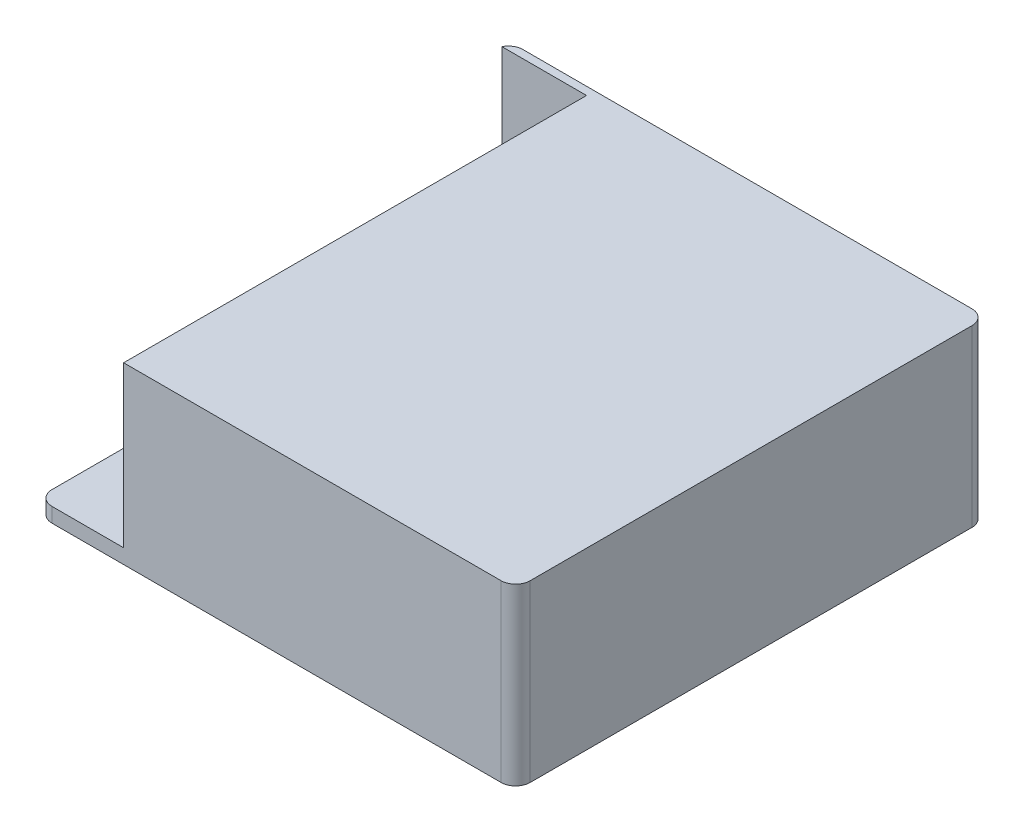
ISO-10303-21;
HEADER;
FILE_DESCRIPTION(('STEP AP214'),'2;1');
FILE_NAME('part.step','',(''),(''),'','','');
FILE_SCHEMA(('AUTOMOTIVE_DESIGN { 1 0 10303 214 1 1 1 1 }'));
ENDSEC;
DATA;
#1=APPLICATION_CONTEXT('core data for automotive mechanical design processes');
#2=APPLICATION_PROTOCOL_DEFINITION('international standard','automotive_design',2000,#1);
#3=PRODUCT_CONTEXT('',#1,'mechanical');
#4=PRODUCT('Part','Part','',(#3));
#5=PRODUCT_RELATED_PRODUCT_CATEGORY('part','',(#4));
#6=PRODUCT_DEFINITION_FORMATION('','',#4);
#7=PRODUCT_DEFINITION_CONTEXT('part definition',#1,'design');
#8=PRODUCT_DEFINITION('design','',#6,#7);
#9=PRODUCT_DEFINITION_SHAPE('','',#8);
#10=(LENGTH_UNIT() NAMED_UNIT(*) SI_UNIT(.MILLI.,.METRE.));
#11=(NAMED_UNIT(*) PLANE_ANGLE_UNIT() SI_UNIT($,.RADIAN.));
#12=(NAMED_UNIT(*) SI_UNIT($,.STERADIAN.) SOLID_ANGLE_UNIT());
#13=UNCERTAINTY_MEASURE_WITH_UNIT(LENGTH_MEASURE(1.E-05),#10,'distance_accuracy_value','');
#14=(GEOMETRIC_REPRESENTATION_CONTEXT(3) GLOBAL_UNCERTAINTY_ASSIGNED_CONTEXT((#13)) GLOBAL_UNIT_ASSIGNED_CONTEXT((#10,
#11,#12)) REPRESENTATION_CONTEXT('',''));
#15=CARTESIAN_POINT('',(0.,0.,0.));
#16=DIRECTION('',(0.,0.,1.));
#17=DIRECTION('',(1.,0.,0.));
#18=AXIS2_PLACEMENT_3D('',#15,#16,#17);
#19=CARTESIAN_POINT('',(-49.25,15.,-37.7044971877989));
#20=DIRECTION('',(1.,0.,0.));
#21=DIRECTION('',(0.,0.,-1.));
#22=AXIS2_PLACEMENT_3D('',#19,#20,#21);
#23=PLANE('',#22);
#24=DIRECTION('',(0.,0.,1.));
#25=VECTOR('',#24,1.);
#26=CARTESIAN_POINT('',(-49.25,3.,-37.7044971877989));
#27=LINE('',#26,#25);
#28=CARTESIAN_POINT('',(-49.25,3.,-37.7044971877989));
#29=VERTEX_POINT('',#28);
#30=CARTESIAN_POINT('',(-49.25,3.,20.5839109430793));
#31=VERTEX_POINT('',#30);
#32=EDGE_CURVE('E108',#29,#31,#27,.T.);
#33=ORIENTED_EDGE('',*,*,#32,.T.);
#34=DIRECTION('',(0.,-1.,0.));
#35=VECTOR('',#34,1.);
#36=CARTESIAN_POINT('',(-49.25,15.,20.5839109430793));
#37=LINE('',#36,#35);
#38=CARTESIAN_POINT('',(-49.25,15.,20.5839109430793));
#39=VERTEX_POINT('',#38);
#40=EDGE_CURVE('E12',#39,#31,#37,.T.);
#41=ORIENTED_EDGE('',*,*,#40,.F.);
#42=DIRECTION('',(0.,0.,1.));
#43=VECTOR('',#42,1.);
#44=CARTESIAN_POINT('',(-49.25,15.,-37.7044971877989));
#45=LINE('',#44,#43);
#46=CARTESIAN_POINT('',(-49.25,15.,-37.7044971877989));
#47=VERTEX_POINT('',#46);
#48=EDGE_CURVE('E96',#47,#39,#45,.T.);
#49=ORIENTED_EDGE('',*,*,#48,.F.);
#50=DIRECTION('',(0.,-1.,0.));
#51=VECTOR('',#50,1.);
#52=CARTESIAN_POINT('',(-49.25,15.,-37.7044971877989));
#53=LINE('',#52,#51);
#54=EDGE_CURVE('E104',#47,#29,#53,.T.);
#55=ORIENTED_EDGE('',*,*,#54,.T.);
#56=EDGE_LOOP('',(#33,#41,#49,#55));
#57=FACE_BOUND('',#56,.T.);
#58=ADVANCED_FACE('F45',(#57),#23,.F.);
#59=CARTESIAN_POINT('',(-49.25,15.,20.5839109430793));
#60=DIRECTION('',(0.,0.,-1.));
#61=DIRECTION('',(-1.,0.,0.));
#62=AXIS2_PLACEMENT_3D('',#59,#60,#61);
#63=PLANE('',#62);
#64=DIRECTION('',(1.,0.,0.));
#65=VECTOR('',#64,1.);
#66=CARTESIAN_POINT('',(-49.25,3.,20.5839109430793));
#67=LINE('',#66,#65);
#68=CARTESIAN_POINT('',(-31.4966510303624,3.,20.5839109430793));
#69=VERTEX_POINT('',#68);
#70=EDGE_CURVE('E100',#31,#69,#67,.T.);
#71=ORIENTED_EDGE('',*,*,#70,.T.);
#72=DIRECTION('',(0.,-1.,0.));
#73=VECTOR('',#72,1.);
#74=CARTESIAN_POINT('',(-31.4966510303624,15.,20.5839109430793));
#75=LINE('',#74,#73);
#76=CARTESIAN_POINT('',(-31.4966510303624,15.,20.5839109430793));
#77=VERTEX_POINT('',#76);
#78=EDGE_CURVE('E53',#77,#69,#75,.T.);
#79=ORIENTED_EDGE('',*,*,#78,.F.);
#80=DIRECTION('',(1.,0.,0.));
#81=VECTOR('',#80,1.);
#82=CARTESIAN_POINT('',(-49.25,15.,20.5839109430793));
#83=LINE('',#82,#81);
#84=EDGE_CURVE('E91',#39,#77,#83,.T.);
#85=ORIENTED_EDGE('',*,*,#84,.F.);
#86=ORIENTED_EDGE('',*,*,#40,.T.);
#87=EDGE_LOOP('',(#71,#79,#85,#86));
#88=FACE_BOUND('',#87,.T.);
#89=ADVANCED_FACE('F99',(#88),#63,.F.);
#90=CARTESIAN_POINT('',(-31.4966510303624,15.,-37.7044971877989));
#91=DIRECTION('',(-1.,0.,0.));
#92=DIRECTION('',(0.,0.,1.));
#93=AXIS2_PLACEMENT_3D('',#90,#91,#92);
#94=PLANE('',#93);
#95=DIRECTION('',(0.,0.,-1.));
#96=VECTOR('',#95,1.);
#97=CARTESIAN_POINT('',(-31.4966510303624,3.,-37.7044971877989));
#98=LINE('',#97,#96);
#99=CARTESIAN_POINT('',(-31.4966510303624,3.,-37.7044971877989));
#100=VERTEX_POINT('',#99);
#101=EDGE_CURVE('E78',#69,#100,#98,.T.);
#102=ORIENTED_EDGE('',*,*,#101,.T.);
#103=DIRECTION('',(0.,-1.,0.));
#104=VECTOR('',#103,1.);
#105=CARTESIAN_POINT('',(-31.4966510303624,15.,-37.7044971877989));
#106=LINE('',#105,#104);
#107=CARTESIAN_POINT('',(-31.4966510303624,15.,-37.7044971877989));
#108=VERTEX_POINT('',#107);
#109=EDGE_CURVE('E101',#108,#100,#106,.T.);
#110=ORIENTED_EDGE('',*,*,#109,.F.);
#111=DIRECTION('',(0.,0.,-1.));
#112=VECTOR('',#111,1.);
#113=CARTESIAN_POINT('',(-31.4966510303624,15.,-37.7044971877989));
#114=LINE('',#113,#112);
#115=EDGE_CURVE('E94',#77,#108,#114,.T.);
#116=ORIENTED_EDGE('',*,*,#115,.F.);
#117=ORIENTED_EDGE('',*,*,#78,.T.);
#118=EDGE_LOOP('',(#102,#110,#116,#117));
#119=FACE_BOUND('',#118,.T.);
#120=ADVANCED_FACE('F102',(#119),#94,.F.);
#121=CARTESIAN_POINT('',(-49.25,15.,-37.7044971877989));
#122=DIRECTION('',(0.,0.,1.));
#123=DIRECTION('',(1.,0.,0.));
#124=AXIS2_PLACEMENT_3D('',#121,#122,#123);
#125=PLANE('',#124);
#126=DIRECTION('',(-1.,0.,0.));
#127=VECTOR('',#126,1.);
#128=CARTESIAN_POINT('',(-49.25,3.,-37.7044971877989));
#129=LINE('',#128,#127);
#130=EDGE_CURVE('E84',#100,#29,#129,.T.);
#131=ORIENTED_EDGE('',*,*,#130,.T.);
#132=ORIENTED_EDGE('',*,*,#54,.F.);
#133=DIRECTION('',(-1.,0.,0.));
#134=VECTOR('',#133,1.);
#135=CARTESIAN_POINT('',(-49.25,15.,-37.7044971877989));
#136=LINE('',#135,#134);
#137=EDGE_CURVE('E61',#108,#47,#136,.T.);
#138=ORIENTED_EDGE('',*,*,#137,.F.);
#139=ORIENTED_EDGE('',*,*,#109,.T.);
#140=EDGE_LOOP('',(#131,#132,#138,#139));
#141=FACE_BOUND('',#140,.T.);
#142=ADVANCED_FACE('F115',(#141),#125,.F.);
#143=CARTESIAN_POINT('',(0.,15.,0.));
#144=DIRECTION('',(0.,1.,0.));
#145=DIRECTION('',(0.,0.,1.));
#146=AXIS2_PLACEMENT_3D('',#143,#144,#145);
#147=PLANE('',#146);
#148=ORIENTED_EDGE('',*,*,#48,.T.);
#149=ORIENTED_EDGE('',*,*,#84,.T.);
#150=ORIENTED_EDGE('',*,*,#115,.T.);
#151=ORIENTED_EDGE('',*,*,#137,.T.);
#152=EDGE_LOOP('',(#148,#149,#150,#151));
#153=FACE_BOUND('',#152,.T.);
#154=ADVANCED_FACE('F92',(#153),#147,.T.);
#155=CARTESIAN_POINT('',(0.,3.,0.));
#156=DIRECTION('',(0.,1.,0.));
#157=DIRECTION('',(0.,0.,1.));
#158=AXIS2_PLACEMENT_3D('',#155,#156,#157);
#159=PLANE('',#158);
#160=ORIENTED_EDGE('',*,*,#32,.F.);
#161=ORIENTED_EDGE('',*,*,#130,.F.);
#162=ORIENTED_EDGE('',*,*,#101,.F.);
#163=ORIENTED_EDGE('',*,*,#70,.F.);
#164=EDGE_LOOP('',(#160,#161,#162,#163));
#165=FACE_BOUND('',#164,.T.);
#166=ADVANCED_FACE('F118',(#165),#159,.F.);
#167=CLOSED_SHELL('',(#58,#89,#120,#142,#154,#166));
#168=MANIFOLD_SOLID_BREP('B2',#167);
#169=CARTESIAN_POINT('',(-49.25,36.,-45.5));
#170=DIRECTION('',(1.,0.,0.));
#171=DIRECTION('',(0.,0.,-1.));
#172=AXIS2_PLACEMENT_3D('',#169,#170,#171);
#173=PLANE('',#172);
#174=DIRECTION('',(0.,0.,1.));
#175=VECTOR('',#174,1.);
#176=CARTESIAN_POINT('',(-49.25,3.,-45.5));
#177=LINE('',#176,#175);
#178=CARTESIAN_POINT('',(-49.25,3.,-45.5));
#179=VERTEX_POINT('',#178);
#180=CARTESIAN_POINT('',(-49.25,3.,45.5));
#181=VERTEX_POINT('',#180);
#182=EDGE_CURVE('E317',#179,#181,#177,.T.);
#183=ORIENTED_EDGE('',*,*,#182,.F.);
#184=DIRECTION('',(0.,-1.,0.));
#185=VECTOR('',#184,1.);
#186=CARTESIAN_POINT('',(-49.25,36.,-45.5));
#187=LINE('',#186,#185);
#188=CARTESIAN_POINT('',(-49.25,0.,-45.5));
#189=VERTEX_POINT('',#188);
#190=EDGE_CURVE('E295',#179,#189,#187,.T.);
#191=ORIENTED_EDGE('',*,*,#190,.T.);
#192=DIRECTION('',(0.,0.,1.));
#193=VECTOR('',#192,1.);
#194=CARTESIAN_POINT('',(-49.25,0.,-45.5));
#195=LINE('',#194,#193);
#196=CARTESIAN_POINT('',(-49.25,0.,45.5));
#197=VERTEX_POINT('',#196);
#198=EDGE_CURVE('E282',#189,#197,#195,.T.);
#199=ORIENTED_EDGE('',*,*,#198,.T.);
#200=DIRECTION('',(0.,-1.,0.));
#201=VECTOR('',#200,1.);
#202=CARTESIAN_POINT('',(-49.25,36.,45.5));
#203=LINE('',#202,#201);
#204=EDGE_CURVE('E293',#181,#197,#203,.T.);
#205=ORIENTED_EDGE('',*,*,#204,.F.);
#206=EDGE_LOOP('',(#183,#191,#199,#205));
#207=FACE_BOUND('',#206,.T.);
#208=ADVANCED_FACE('F169',(#207),#173,.F.);
#209=CARTESIAN_POINT('',(-46.25,36.,45.5));
#210=DIRECTION('',(0.,-1.,0.));
#211=DIRECTION('',(0.,0.,-1.));
#212=AXIS2_PLACEMENT_3D('',#209,#210,#211);
#213=CYLINDRICAL_SURFACE('',#212,3.);
#214=CARTESIAN_POINT('',(-46.25,3.,45.5));
#215=DIRECTION('',(0.,1.,0.));
#216=DIRECTION('',(0.,0.,1.));
#217=AXIS2_PLACEMENT_3D('',#214,#215,#216);
#218=CIRCLE('',#217,3.);
#219=CARTESIAN_POINT('',(-46.25,3.,48.5));
#220=VERTEX_POINT('',#219);
#221=EDGE_CURVE('E320',#181,#220,#218,.T.);
#222=ORIENTED_EDGE('',*,*,#221,.F.);
#223=ORIENTED_EDGE('',*,*,#204,.T.);
#224=CARTESIAN_POINT('',(-46.25,0.,45.5));
#225=DIRECTION('',(0.,1.,0.));
#226=DIRECTION('',(0.,0.,1.));
#227=AXIS2_PLACEMENT_3D('',#224,#225,#226);
#228=CIRCLE('',#227,3.);
#229=CARTESIAN_POINT('',(-46.25,0.,48.5));
#230=VERTEX_POINT('',#229);
#231=EDGE_CURVE('E285',#197,#230,#228,.T.);
#232=ORIENTED_EDGE('',*,*,#231,.T.);
#233=DIRECTION('',(0.,-1.,0.));
#234=VECTOR('',#233,1.);
#235=CARTESIAN_POINT('',(-46.25,36.,48.5));
#236=LINE('',#235,#234);
#237=EDGE_CURVE('E291',#220,#230,#236,.T.);
#238=ORIENTED_EDGE('',*,*,#237,.F.);
#239=EDGE_LOOP('',(#222,#223,#232,#238));
#240=FACE_BOUND('',#239,.T.);
#241=ADVANCED_FACE('F368',(#240),#213,.T.);
#242=CARTESIAN_POINT('',(46.25,36.,45.5));
#243=DIRECTION('',(0.,-1.,0.));
#244=DIRECTION('',(0.,0.,-1.));
#245=AXIS2_PLACEMENT_3D('',#242,#243,#244);
#246=CYLINDRICAL_SURFACE('',#245,3.);
#247=CARTESIAN_POINT('',(46.25,0.,45.5));
#248=DIRECTION('',(0.,1.,0.));
#249=DIRECTION('',(0.,0.,-1.));
#250=AXIS2_PLACEMENT_3D('',#247,#248,#249);
#251=CIRCLE('',#250,3.);
#252=CARTESIAN_POINT('',(46.25,0.,48.5));
#253=VERTEX_POINT('',#252);
#254=CARTESIAN_POINT('',(49.25,0.,45.5));
#255=VERTEX_POINT('',#254);
#256=EDGE_CURVE('E270',#253,#255,#251,.T.);
#257=ORIENTED_EDGE('',*,*,#256,.T.);
#258=DIRECTION('',(0.,-1.,0.));
#259=VECTOR('',#258,1.);
#260=CARTESIAN_POINT('',(49.25,36.,45.5));
#261=LINE('',#260,#259);
#262=CARTESIAN_POINT('',(49.25,36.,45.5));
#263=VERTEX_POINT('',#262);
#264=EDGE_CURVE('E299',#263,#255,#261,.T.);
#265=ORIENTED_EDGE('',*,*,#264,.F.);
#266=CARTESIAN_POINT('',(46.25,36.,45.5));
#267=DIRECTION('',(0.,1.,0.));
#268=DIRECTION('',(0.,0.,-1.));
#269=AXIS2_PLACEMENT_3D('',#266,#267,#268);
#270=CIRCLE('',#269,3.);
#271=CARTESIAN_POINT('',(46.25,36.,48.5));
#272=VERTEX_POINT('',#271);
#273=EDGE_CURVE('E289',#272,#263,#270,.T.);
#274=ORIENTED_EDGE('',*,*,#273,.F.);
#275=DIRECTION('',(0.,-1.,0.));
#276=VECTOR('',#275,1.);
#277=CARTESIAN_POINT('',(46.25,36.,48.5));
#278=LINE('',#277,#276);
#279=EDGE_CURVE('E269',#272,#253,#278,.T.);
#280=ORIENTED_EDGE('',*,*,#279,.T.);
#281=EDGE_LOOP('',(#257,#265,#274,#280));
#282=FACE_BOUND('',#281,.T.);
#283=ADVANCED_FACE('F171',(#282),#246,.T.);
#284=CARTESIAN_POINT('',(49.25,36.,-45.5));
#285=DIRECTION('',(-1.,0.,0.));
#286=DIRECTION('',(0.,0.,1.));
#287=AXIS2_PLACEMENT_3D('',#284,#285,#286);
#288=PLANE('',#287);
#289=DIRECTION('',(0.,0.,-1.));
#290=VECTOR('',#289,1.);
#291=CARTESIAN_POINT('',(49.25,0.,-45.5));
#292=LINE('',#291,#290);
#293=CARTESIAN_POINT('',(49.25,0.,-45.5));
#294=VERTEX_POINT('',#293);
#295=EDGE_CURVE('E273',#255,#294,#292,.T.);
#296=ORIENTED_EDGE('',*,*,#295,.T.);
#297=DIRECTION('',(0.,-1.,0.));
#298=VECTOR('',#297,1.);
#299=CARTESIAN_POINT('',(49.25,36.,-45.5));
#300=LINE('',#299,#298);
#301=CARTESIAN_POINT('',(49.25,36.,-45.5));
#302=VERTEX_POINT('',#301);
#303=EDGE_CURVE('E257',#302,#294,#300,.T.);
#304=ORIENTED_EDGE('',*,*,#303,.F.);
#305=DIRECTION('',(0.,0.,-1.));
#306=VECTOR('',#305,1.);
#307=CARTESIAN_POINT('',(49.25,36.,-45.5));
#308=LINE('',#307,#306);
#309=EDGE_CURVE('E234',#263,#302,#308,.T.);
#310=ORIENTED_EDGE('',*,*,#309,.F.);
#311=ORIENTED_EDGE('',*,*,#264,.T.);
#312=EDGE_LOOP('',(#296,#304,#310,#311));
#313=FACE_BOUND('',#312,.T.);
#314=ADVANCED_FACE('F375',(#313),#288,.F.);
#315=CARTESIAN_POINT('',(46.25,36.,-45.5));
#316=DIRECTION('',(0.,-1.,0.));
#317=DIRECTION('',(0.,0.,-1.));
#318=AXIS2_PLACEMENT_3D('',#315,#316,#317);
#319=CYLINDRICAL_SURFACE('',#318,3.);
#320=CARTESIAN_POINT('',(46.25,0.,-45.5));
#321=DIRECTION('',(0.,1.,0.));
#322=DIRECTION('',(0.,0.,1.));
#323=AXIS2_PLACEMENT_3D('',#320,#321,#322);
#324=CIRCLE('',#323,3.);
#325=CARTESIAN_POINT('',(46.25,0.,-48.5));
#326=VERTEX_POINT('',#325);
#327=EDGE_CURVE('E254',#294,#326,#324,.T.);
#328=ORIENTED_EDGE('',*,*,#327,.T.);
#329=DIRECTION('',(0.,-1.,0.));
#330=VECTOR('',#329,1.);
#331=CARTESIAN_POINT('',(46.25,36.,-48.5));
#332=LINE('',#331,#330);
#333=CARTESIAN_POINT('',(46.25,36.,-48.5));
#334=VERTEX_POINT('',#333);
#335=EDGE_CURVE('E251',#334,#326,#332,.T.);
#336=ORIENTED_EDGE('',*,*,#335,.F.);
#337=CARTESIAN_POINT('',(46.25,36.,-45.5));
#338=DIRECTION('',(0.,1.,0.));
#339=DIRECTION('',(0.,0.,1.));
#340=AXIS2_PLACEMENT_3D('',#337,#338,#339);
#341=CIRCLE('',#340,3.);
#342=EDGE_CURVE('E240',#302,#334,#341,.T.);
#343=ORIENTED_EDGE('',*,*,#342,.F.);
#344=ORIENTED_EDGE('',*,*,#303,.T.);
#345=EDGE_LOOP('',(#328,#336,#343,#344));
#346=FACE_BOUND('',#345,.T.);
#347=ADVANCED_FACE('F252',(#346),#319,.T.);
#348=CARTESIAN_POINT('',(-46.25,36.,-48.5));
#349=DIRECTION('',(0.,0.,1.));
#350=DIRECTION('',(1.,0.,0.));
#351=AXIS2_PLACEMENT_3D('',#348,#349,#350);
#352=PLANE('',#351);
#353=DIRECTION('',(-1.,0.,0.));
#354=VECTOR('',#353,1.);
#355=CARTESIAN_POINT('',(-46.25,0.,-48.5));
#356=LINE('',#355,#354);
#357=CARTESIAN_POINT('',(-46.25,0.,-48.5));
#358=VERTEX_POINT('',#357);
#359=EDGE_CURVE('E277',#326,#358,#356,.T.);
#360=ORIENTED_EDGE('',*,*,#359,.T.);
#361=DIRECTION('',(0.,-1.,0.));
#362=VECTOR('',#361,1.);
#363=CARTESIAN_POINT('',(-46.25,36.,-48.5));
#364=LINE('',#363,#362);
#365=CARTESIAN_POINT('',(-46.25,36.,-48.5));
#366=VERTEX_POINT('',#365);
#367=EDGE_CURVE('E258',#366,#358,#364,.T.);
#368=ORIENTED_EDGE('',*,*,#367,.F.);
#369=DIRECTION('',(-1.,0.,0.));
#370=VECTOR('',#369,1.);
#371=CARTESIAN_POINT('',(-46.25,36.,-48.5));
#372=LINE('',#371,#370);
#373=EDGE_CURVE('E245',#334,#366,#372,.T.);
#374=ORIENTED_EDGE('',*,*,#373,.F.);
#375=ORIENTED_EDGE('',*,*,#335,.T.);
#376=EDGE_LOOP('',(#360,#368,#374,#375));
#377=FACE_BOUND('',#376,.T.);
#378=ADVANCED_FACE('F260',(#377),#352,.F.);
#379=CARTESIAN_POINT('',(-46.25,36.,-45.5));
#380=DIRECTION('',(0.,-1.,0.));
#381=DIRECTION('',(0.,0.,-1.));
#382=AXIS2_PLACEMENT_3D('',#379,#380,#381);
#383=CYLINDRICAL_SURFACE('',#382,3.);
#384=CARTESIAN_POINT('',(-46.25,3.,-45.5));
#385=DIRECTION('',(0.,1.,0.));
#386=DIRECTION('',(0.,0.,1.));
#387=AXIS2_PLACEMENT_3D('',#384,#385,#386);
#388=CIRCLE('',#387,3.);
#389=CARTESIAN_POINT('',(-48.9276213397987,3.,-46.8529020513899));
#390=VERTEX_POINT('',#389);
#391=EDGE_CURVE('E274',#390,#179,#388,.T.);
#392=ORIENTED_EDGE('',*,*,#391,.F.);
#393=DIRECTION('',(0.,-1.,0.));
#394=VECTOR('',#393,1.);
#395=CARTESIAN_POINT('',(-48.9276213397987,36.,-46.8529020513899));
#396=LINE('',#395,#394);
#397=CARTESIAN_POINT('',(-48.9276213397987,36.,-46.8529020513899));
#398=VERTEX_POINT('',#397);
#399=EDGE_CURVE('E323',#390,#398,#396,.F.);
#400=ORIENTED_EDGE('',*,*,#399,.T.);
#401=CARTESIAN_POINT('',(-46.25,36.,-45.5));
#402=DIRECTION('',(0.,1.,0.));
#403=DIRECTION('',(0.,0.,-1.));
#404=AXIS2_PLACEMENT_3D('',#401,#402,#403);
#405=CIRCLE('',#404,3.);
#406=EDGE_CURVE('E263',#366,#398,#405,.T.);
#407=ORIENTED_EDGE('',*,*,#406,.F.);
#408=ORIENTED_EDGE('',*,*,#367,.T.);
#409=CARTESIAN_POINT('',(-46.25,0.,-45.5));
#410=DIRECTION('',(0.,1.,0.));
#411=DIRECTION('',(0.,0.,-1.));
#412=AXIS2_PLACEMENT_3D('',#409,#410,#411);
#413=CIRCLE('',#412,3.);
#414=EDGE_CURVE('E279',#358,#189,#413,.T.);
#415=ORIENTED_EDGE('',*,*,#414,.T.);
#416=ORIENTED_EDGE('',*,*,#190,.F.);
#417=EDGE_LOOP('',(#392,#400,#407,#408,#415,#416));
#418=FACE_BOUND('',#417,.T.);
#419=ADVANCED_FACE('F350',(#418),#383,.T.);
#420=CARTESIAN_POINT('',(-46.25,36.,48.5));
#421=DIRECTION('',(0.,0.,-1.));
#422=DIRECTION('',(-1.,0.,0.));
#423=AXIS2_PLACEMENT_3D('',#420,#421,#422);
#424=PLANE('',#423);
#425=DIRECTION('',(1.,0.,0.));
#426=VECTOR('',#425,1.);
#427=CARTESIAN_POINT('',(-46.25,36.,48.5));
#428=LINE('',#427,#426);
#429=CARTESIAN_POINT('',(-31.4966510303624,36.,48.5));
#430=VERTEX_POINT('',#429);
#431=EDGE_CURVE('E192',#430,#272,#428,.T.);
#432=ORIENTED_EDGE('',*,*,#431,.F.);
#433=DIRECTION('',(0.,-1.,0.));
#434=VECTOR('',#433,1.);
#435=CARTESIAN_POINT('',(-31.4966510303624,36.,48.5));
#436=LINE('',#435,#434);
#437=CARTESIAN_POINT('',(-31.4966510303624,3.,48.5));
#438=VERTEX_POINT('',#437);
#439=EDGE_CURVE('E184',#430,#438,#436,.T.);
#440=ORIENTED_EDGE('',*,*,#439,.T.);
#441=DIRECTION('',(1.,0.,0.));
#442=VECTOR('',#441,1.);
#443=CARTESIAN_POINT('',(-46.25,3.,48.5));
#444=LINE('',#443,#442);
#445=EDGE_CURVE('E43',#220,#438,#444,.T.);
#446=ORIENTED_EDGE('',*,*,#445,.F.);
#447=ORIENTED_EDGE('',*,*,#237,.T.);
#448=DIRECTION('',(1.,0.,0.));
#449=VECTOR('',#448,1.);
#450=CARTESIAN_POINT('',(-46.25,0.,48.5));
#451=LINE('',#450,#449);
#452=EDGE_CURVE('E225',#230,#253,#451,.T.);
#453=ORIENTED_EDGE('',*,*,#452,.T.);
#454=ORIENTED_EDGE('',*,*,#279,.F.);
#455=EDGE_LOOP('',(#432,#440,#446,#447,#453,#454));
#456=FACE_BOUND('',#455,.T.);
#457=ADVANCED_FACE('F306',(#456),#424,.F.);
#458=CARTESIAN_POINT('',(46.25,36.,45.5));
#459=DIRECTION('',(0.,-1.,0.));
#460=DIRECTION('',(0.,0.,-1.));
#461=AXIS2_PLACEMENT_3D('',#458,#459,#460);
#462=PLANE('',#461);
#463=ORIENTED_EDGE('',*,*,#406,.T.);
#464=DIRECTION('',(-1.,0.,0.));
#465=VECTOR('',#464,1.);
#466=CARTESIAN_POINT('',(-56.5894186562113,36.,-46.8529020513899));
#467=LINE('',#466,#465);
#468=CARTESIAN_POINT('',(-31.4966510303624,36.,-46.8529020513899));
#469=VERTEX_POINT('',#468);
#470=EDGE_CURVE('E303',#469,#398,#467,.T.);
#471=ORIENTED_EDGE('',*,*,#470,.F.);
#472=DIRECTION('',(0.,0.,1.));
#473=VECTOR('',#472,1.);
#474=CARTESIAN_POINT('',(-31.4966510303624,36.,45.5));
#475=LINE('',#474,#473);
#476=EDGE_CURVE('E177',#469,#430,#475,.T.);
#477=ORIENTED_EDGE('',*,*,#476,.T.);
#478=ORIENTED_EDGE('',*,*,#431,.T.);
#479=ORIENTED_EDGE('',*,*,#273,.T.);
#480=ORIENTED_EDGE('',*,*,#309,.T.);
#481=ORIENTED_EDGE('',*,*,#342,.T.);
#482=ORIENTED_EDGE('',*,*,#373,.T.);
#483=EDGE_LOOP('',(#463,#471,#477,#478,#479,#480,#481,#482));
#484=FACE_BOUND('',#483,.T.);
#485=ADVANCED_FACE('F243',(#484),#462,.F.);
#486=CARTESIAN_POINT('',(46.25,0.,45.5));
#487=DIRECTION('',(0.,-1.,0.));
#488=DIRECTION('',(0.,0.,-1.));
#489=AXIS2_PLACEMENT_3D('',#486,#487,#488);
#490=PLANE('',#489);
#491=ORIENTED_EDGE('',*,*,#256,.F.);
#492=ORIENTED_EDGE('',*,*,#452,.F.);
#493=ORIENTED_EDGE('',*,*,#231,.F.);
#494=ORIENTED_EDGE('',*,*,#198,.F.);
#495=ORIENTED_EDGE('',*,*,#414,.F.);
#496=ORIENTED_EDGE('',*,*,#359,.F.);
#497=ORIENTED_EDGE('',*,*,#327,.F.);
#498=ORIENTED_EDGE('',*,*,#295,.F.);
#499=EDGE_LOOP('',(#491,#492,#493,#494,#495,#496,#497,#498));
#500=FACE_BOUND('',#499,.T.);
#501=ADVANCED_FACE('F365',(#500),#490,.T.);
#502=CARTESIAN_POINT('',(0.,3.,0.));
#503=DIRECTION('',(0.,1.,0.));
#504=DIRECTION('',(0.,0.,1.));
#505=AXIS2_PLACEMENT_3D('',#502,#503,#504);
#506=PLANE('',#505);
#507=ORIENTED_EDGE('',*,*,#391,.T.);
#508=ORIENTED_EDGE('',*,*,#182,.T.);
#509=ORIENTED_EDGE('',*,*,#221,.T.);
#510=ORIENTED_EDGE('',*,*,#445,.T.);
#511=DIRECTION('',(0.,0.,-1.));
#512=VECTOR('',#511,1.);
#513=CARTESIAN_POINT('',(-31.4966510303624,3.,-46.8529020513899));
#514=LINE('',#513,#512);
#515=CARTESIAN_POINT('',(-31.4966510303624,3.,-46.8529020513899));
#516=VERTEX_POINT('',#515);
#517=EDGE_CURVE('E331',#438,#516,#514,.T.);
#518=ORIENTED_EDGE('',*,*,#517,.T.);
#519=DIRECTION('',(-1.,0.,0.));
#520=VECTOR('',#519,1.);
#521=CARTESIAN_POINT('',(-56.5894186562113,3.,-46.8529020513899));
#522=LINE('',#521,#520);
#523=EDGE_CURVE('E329',#516,#390,#522,.T.);
#524=ORIENTED_EDGE('',*,*,#523,.T.);
#525=EDGE_LOOP('',(#507,#508,#509,#510,#518,#524));
#526=FACE_BOUND('',#525,.T.);
#527=ADVANCED_FACE('F337',(#526),#506,.T.);
#528=CARTESIAN_POINT('',(-56.5894186562113,3.,-46.8529020513899));
#529=DIRECTION('',(0.,0.,-1.));
#530=DIRECTION('',(-1.,0.,0.));
#531=AXIS2_PLACEMENT_3D('',#528,#529,#530);
#532=PLANE('',#531);
#533=ORIENTED_EDGE('',*,*,#523,.F.);
#534=DIRECTION('',(0.,1.,0.));
#535=VECTOR('',#534,1.);
#536=CARTESIAN_POINT('',(-31.4966510303624,3.,-46.8529020513899));
#537=LINE('',#536,#535);
#538=EDGE_CURVE('E327',#516,#469,#537,.T.);
#539=ORIENTED_EDGE('',*,*,#538,.T.);
#540=ORIENTED_EDGE('',*,*,#470,.T.);
#541=ORIENTED_EDGE('',*,*,#399,.F.);
#542=EDGE_LOOP('',(#533,#539,#540,#541));
#543=FACE_BOUND('',#542,.T.);
#544=ADVANCED_FACE('F345',(#543),#532,.F.);
#545=CARTESIAN_POINT('',(-31.4966510303624,3.,-46.8529020513899));
#546=DIRECTION('',(1.,0.,0.));
#547=DIRECTION('',(0.,0.,-1.));
#548=AXIS2_PLACEMENT_3D('',#545,#546,#547);
#549=PLANE('',#548);
#550=ORIENTED_EDGE('',*,*,#476,.F.);
#551=ORIENTED_EDGE('',*,*,#538,.F.);
#552=ORIENTED_EDGE('',*,*,#517,.F.);
#553=ORIENTED_EDGE('',*,*,#439,.F.);
#554=EDGE_LOOP('',(#550,#551,#552,#553));
#555=FACE_BOUND('',#554,.T.);
#556=ADVANCED_FACE('F342',(#555),#549,.F.);
#557=CLOSED_SHELL('',(#208,#241,#283,#314,#347,#378,#419,#457,#485,#501,#527,#544,#556));
#558=MANIFOLD_SOLID_BREP('B6',#557);
#559=ADVANCED_BREP_SHAPE_REPRESENTATION('',(#18,#168,#558),#14);
#560=SHAPE_DEFINITION_REPRESENTATION(#9,#559);
ENDSEC;
END-ISO-10303-21;
